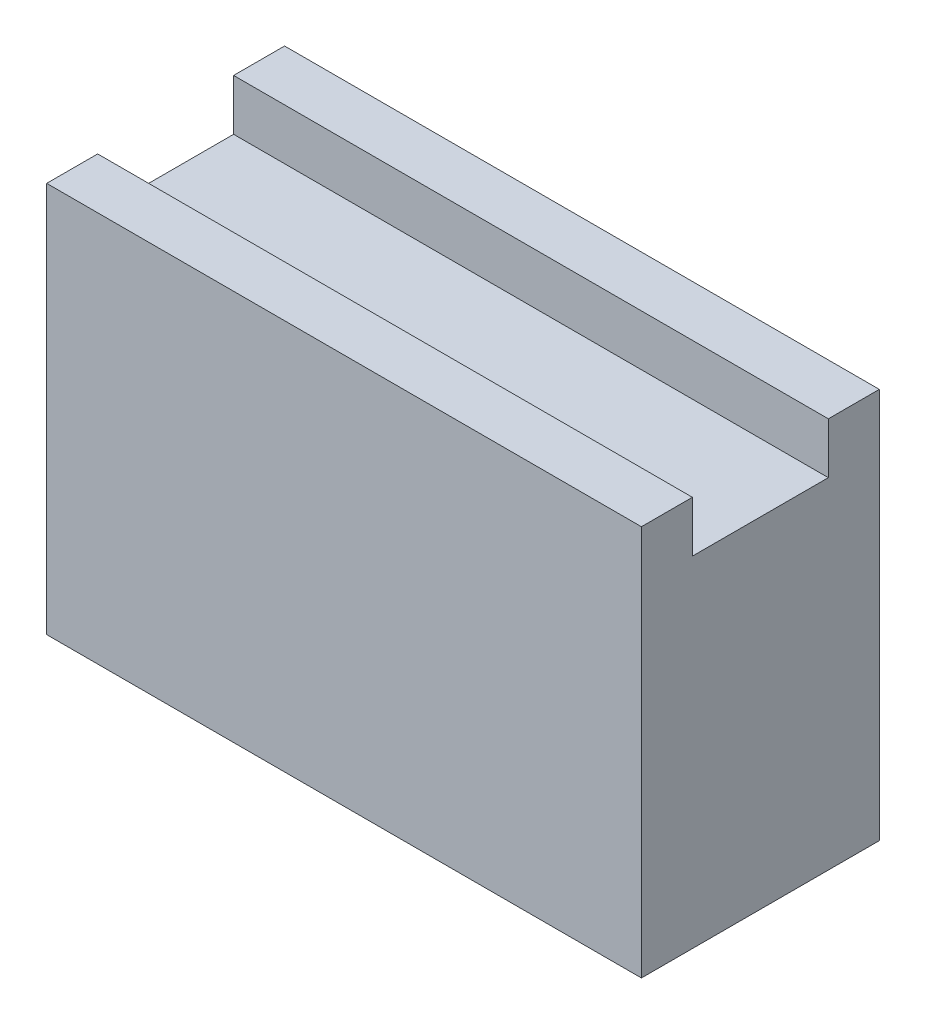
ISO-10303-21;
HEADER;
FILE_DESCRIPTION(('STEP AP214'),'2;1');
FILE_NAME('part.step','',(''),(''),'','','');
FILE_SCHEMA(('AUTOMOTIVE_DESIGN { 1 0 10303 214 1 1 1 1 }'));
ENDSEC;
DATA;
#1=APPLICATION_CONTEXT('core data for automotive mechanical design processes');
#2=APPLICATION_PROTOCOL_DEFINITION('international standard','automotive_design',2000,#1);
#3=PRODUCT_CONTEXT('',#1,'mechanical');
#4=PRODUCT('Part','Part','',(#3));
#5=PRODUCT_RELATED_PRODUCT_CATEGORY('part','',(#4));
#6=PRODUCT_DEFINITION_FORMATION('','',#4);
#7=PRODUCT_DEFINITION_CONTEXT('part definition',#1,'design');
#8=PRODUCT_DEFINITION('design','',#6,#7);
#9=PRODUCT_DEFINITION_SHAPE('','',#8);
#10=(LENGTH_UNIT() NAMED_UNIT(*) SI_UNIT(.MILLI.,.METRE.));
#11=(NAMED_UNIT(*) PLANE_ANGLE_UNIT() SI_UNIT($,.RADIAN.));
#12=(NAMED_UNIT(*) SI_UNIT($,.STERADIAN.) SOLID_ANGLE_UNIT());
#13=UNCERTAINTY_MEASURE_WITH_UNIT(LENGTH_MEASURE(1.E-05),#10,'distance_accuracy_value','');
#14=(GEOMETRIC_REPRESENTATION_CONTEXT(3) GLOBAL_UNCERTAINTY_ASSIGNED_CONTEXT((#13)) GLOBAL_UNIT_ASSIGNED_CONTEXT((#10,
#11,#12)) REPRESENTATION_CONTEXT('',''));
#15=CARTESIAN_POINT('',(0.,0.,0.));
#16=DIRECTION('',(0.,0.,1.));
#17=DIRECTION('',(1.,0.,0.));
#18=AXIS2_PLACEMENT_3D('',#15,#16,#17);
#19=CARTESIAN_POINT('',(-35.,-10.,-7.));
#20=DIRECTION('',(0.,0.,-1.));
#21=DIRECTION('',(-1.,0.,0.));
#22=AXIS2_PLACEMENT_3D('',#19,#20,#21);
#23=PLANE('',#22);
#24=DIRECTION('',(0.,1.,0.));
#25=VECTOR('',#24,1.);
#26=CARTESIAN_POINT('',(0.,-10.,-7.));
#27=LINE('',#26,#25);
#28=CARTESIAN_POINT('',(0.,-10.,-7.));
#29=VERTEX_POINT('',#28);
#30=CARTESIAN_POINT('',(0.,13.,-7.));
#31=VERTEX_POINT('',#30);
#32=EDGE_CURVE('E155',#29,#31,#27,.T.);
#33=ORIENTED_EDGE('',*,*,#32,.F.);
#34=DIRECTION('',(1.,0.,0.));
#35=VECTOR('',#34,1.);
#36=CARTESIAN_POINT('',(-35.,-10.,-7.));
#37=LINE('',#36,#35);
#38=CARTESIAN_POINT('',(-35.,-10.,-7.));
#39=VERTEX_POINT('',#38);
#40=EDGE_CURVE('E11',#39,#29,#37,.T.);
#41=ORIENTED_EDGE('',*,*,#40,.F.);
#42=DIRECTION('',(0.,1.,0.));
#43=VECTOR('',#42,1.);
#44=CARTESIAN_POINT('',(-35.,9.99999999999999,-7.));
#45=LINE('',#44,#43);
#46=CARTESIAN_POINT('',(-35.,13.,-7.));
#47=VERTEX_POINT('',#46);
#48=EDGE_CURVE('E58',#39,#47,#45,.T.);
#49=ORIENTED_EDGE('',*,*,#48,.T.);
#50=DIRECTION('',(1.,0.,0.));
#51=VECTOR('',#50,1.);
#52=CARTESIAN_POINT('',(-35.,13.,-7.));
#53=LINE('',#52,#51);
#54=EDGE_CURVE('E43',#47,#31,#53,.T.);
#55=ORIENTED_EDGE('',*,*,#54,.T.);
#56=EDGE_LOOP('',(#33,#41,#49,#55));
#57=FACE_BOUND('',#56,.T.);
#58=ADVANCED_FACE('F39',(#57),#23,.T.);
#59=CARTESIAN_POINT('',(-35.,-10.,7.));
#60=DIRECTION('',(0.,-1.,0.));
#61=DIRECTION('',(0.,0.,-1.));
#62=AXIS2_PLACEMENT_3D('',#59,#60,#61);
#63=PLANE('',#62);
#64=DIRECTION('',(0.,0.,-1.));
#65=VECTOR('',#64,1.);
#66=CARTESIAN_POINT('',(0.,-10.,7.));
#67=LINE('',#66,#65);
#68=CARTESIAN_POINT('',(0.,-10.,7.));
#69=VERTEX_POINT('',#68);
#70=EDGE_CURVE('E153',#69,#29,#67,.T.);
#71=ORIENTED_EDGE('',*,*,#70,.F.);
#72=DIRECTION('',(1.,0.,0.));
#73=VECTOR('',#72,1.);
#74=CARTESIAN_POINT('',(-35.,-10.,7.));
#75=LINE('',#74,#73);
#76=CARTESIAN_POINT('',(-35.,-10.,7.));
#77=VERTEX_POINT('',#76);
#78=EDGE_CURVE('E49',#77,#69,#75,.T.);
#79=ORIENTED_EDGE('',*,*,#78,.F.);
#80=DIRECTION('',(0.,0.,-1.));
#81=VECTOR('',#80,1.);
#82=CARTESIAN_POINT('',(-35.,-10.,7.));
#83=LINE('',#82,#81);
#84=EDGE_CURVE('E128',#77,#39,#83,.T.);
#85=ORIENTED_EDGE('',*,*,#84,.T.);
#86=ORIENTED_EDGE('',*,*,#40,.T.);
#87=EDGE_LOOP('',(#71,#79,#85,#86));
#88=FACE_BOUND('',#87,.T.);
#89=ADVANCED_FACE('F168',(#88),#63,.T.);
#90=CARTESIAN_POINT('',(-35.,-10.,7.));
#91=DIRECTION('',(0.,0.,1.));
#92=DIRECTION('',(1.,0.,0.));
#93=AXIS2_PLACEMENT_3D('',#90,#91,#92);
#94=PLANE('',#93);
#95=DIRECTION('',(0.,-1.,0.));
#96=VECTOR('',#95,1.);
#97=CARTESIAN_POINT('',(0.,-10.,7.));
#98=LINE('',#97,#96);
#99=CARTESIAN_POINT('',(0.,13.,7.));
#100=VERTEX_POINT('',#99);
#101=EDGE_CURVE('E116',#100,#69,#98,.T.);
#102=ORIENTED_EDGE('',*,*,#101,.F.);
#103=DIRECTION('',(1.,0.,0.));
#104=VECTOR('',#103,1.);
#105=CARTESIAN_POINT('',(-35.,13.,7.));
#106=LINE('',#105,#104);
#107=CARTESIAN_POINT('',(-35.,13.,7.));
#108=VERTEX_POINT('',#107);
#109=EDGE_CURVE('E111',#108,#100,#106,.T.);
#110=ORIENTED_EDGE('',*,*,#109,.F.);
#111=DIRECTION('',(0.,-1.,0.));
#112=VECTOR('',#111,1.);
#113=CARTESIAN_POINT('',(-35.,9.99999999999999,7.));
#114=LINE('',#113,#112);
#115=EDGE_CURVE('E114',#108,#77,#114,.T.);
#116=ORIENTED_EDGE('',*,*,#115,.T.);
#117=ORIENTED_EDGE('',*,*,#78,.T.);
#118=EDGE_LOOP('',(#102,#110,#116,#117));
#119=FACE_BOUND('',#118,.T.);
#120=ADVANCED_FACE('F113',(#119),#94,.T.);
#121=CARTESIAN_POINT('',(-35.,13.,7.));
#122=DIRECTION('',(0.,1.,0.));
#123=DIRECTION('',(0.,0.,1.));
#124=AXIS2_PLACEMENT_3D('',#121,#122,#123);
#125=PLANE('',#124);
#126=DIRECTION('',(0.,0.,1.));
#127=VECTOR('',#126,1.);
#128=CARTESIAN_POINT('',(0.,13.,7.));
#129=LINE('',#128,#127);
#130=CARTESIAN_POINT('',(0.,13.,4.));
#131=VERTEX_POINT('',#130);
#132=EDGE_CURVE('E150',#131,#100,#129,.T.);
#133=ORIENTED_EDGE('',*,*,#132,.F.);
#134=DIRECTION('',(1.,0.,0.));
#135=VECTOR('',#134,1.);
#136=CARTESIAN_POINT('',(-35.,13.,4.));
#137=LINE('',#136,#135);
#138=CARTESIAN_POINT('',(-35.,13.,4.));
#139=VERTEX_POINT('',#138);
#140=EDGE_CURVE('E121',#139,#131,#137,.T.);
#141=ORIENTED_EDGE('',*,*,#140,.F.);
#142=DIRECTION('',(0.,0.,1.));
#143=VECTOR('',#142,1.);
#144=CARTESIAN_POINT('',(-35.,13.,7.));
#145=LINE('',#144,#143);
#146=EDGE_CURVE('E126',#139,#108,#145,.T.);
#147=ORIENTED_EDGE('',*,*,#146,.T.);
#148=ORIENTED_EDGE('',*,*,#109,.T.);
#149=EDGE_LOOP('',(#133,#141,#147,#148));
#150=FACE_BOUND('',#149,.T.);
#151=ADVANCED_FACE('F130',(#150),#125,.T.);
#152=CARTESIAN_POINT('',(-35.,13.,4.));
#153=DIRECTION('',(0.,0.,-1.));
#154=DIRECTION('',(0.,1.,0.));
#155=AXIS2_PLACEMENT_3D('',#152,#153,#154);
#156=PLANE('',#155);
#157=DIRECTION('',(0.,1.,0.));
#158=VECTOR('',#157,1.);
#159=CARTESIAN_POINT('',(0.,13.,4.));
#160=LINE('',#159,#158);
#161=CARTESIAN_POINT('',(0.,9.99999999999999,4.));
#162=VERTEX_POINT('',#161);
#163=EDGE_CURVE('E147',#162,#131,#160,.T.);
#164=ORIENTED_EDGE('',*,*,#163,.F.);
#165=DIRECTION('',(1.,0.,0.));
#166=VECTOR('',#165,1.);
#167=CARTESIAN_POINT('',(-35.,9.99999999999999,4.));
#168=LINE('',#167,#166);
#169=CARTESIAN_POINT('',(-35.,9.99999999999999,4.));
#170=VERTEX_POINT('',#169);
#171=EDGE_CURVE('E159',#170,#162,#168,.T.);
#172=ORIENTED_EDGE('',*,*,#171,.F.);
#173=DIRECTION('',(0.,1.,0.));
#174=VECTOR('',#173,1.);
#175=CARTESIAN_POINT('',(-35.,13.,4.));
#176=LINE('',#175,#174);
#177=EDGE_CURVE('E131',#170,#139,#176,.T.);
#178=ORIENTED_EDGE('',*,*,#177,.T.);
#179=ORIENTED_EDGE('',*,*,#140,.T.);
#180=EDGE_LOOP('',(#164,#172,#178,#179));
#181=FACE_BOUND('',#180,.T.);
#182=ADVANCED_FACE('F181',(#181),#156,.T.);
#183=CARTESIAN_POINT('',(-35.,9.99999999999999,4.));
#184=DIRECTION('',(0.,1.,0.));
#185=DIRECTION('',(0.,0.,1.));
#186=AXIS2_PLACEMENT_3D('',#183,#184,#185);
#187=PLANE('',#186);
#188=DIRECTION('',(0.,0.,1.));
#189=VECTOR('',#188,1.);
#190=CARTESIAN_POINT('',(0.,9.99999999999999,4.));
#191=LINE('',#190,#189);
#192=CARTESIAN_POINT('',(0.,9.99999999999999,-4.));
#193=VERTEX_POINT('',#192);
#194=EDGE_CURVE('E144',#193,#162,#191,.T.);
#195=ORIENTED_EDGE('',*,*,#194,.F.);
#196=DIRECTION('',(1.,0.,0.));
#197=VECTOR('',#196,1.);
#198=CARTESIAN_POINT('',(-35.,9.99999999999999,-4.));
#199=LINE('',#198,#197);
#200=CARTESIAN_POINT('',(-35.,9.99999999999999,-4.));
#201=VERTEX_POINT('',#200);
#202=EDGE_CURVE('E161',#201,#193,#199,.T.);
#203=ORIENTED_EDGE('',*,*,#202,.F.);
#204=DIRECTION('',(0.,0.,1.));
#205=VECTOR('',#204,1.);
#206=CARTESIAN_POINT('',(-35.,9.99999999999999,4.));
#207=LINE('',#206,#205);
#208=EDGE_CURVE('E133',#201,#170,#207,.T.);
#209=ORIENTED_EDGE('',*,*,#208,.T.);
#210=ORIENTED_EDGE('',*,*,#171,.T.);
#211=EDGE_LOOP('',(#195,#203,#209,#210));
#212=FACE_BOUND('',#211,.T.);
#213=ADVANCED_FACE('F184',(#212),#187,.T.);
#214=CARTESIAN_POINT('',(-35.,13.,-4.));
#215=DIRECTION('',(0.,0.,1.));
#216=DIRECTION('',(0.,-1.,0.));
#217=AXIS2_PLACEMENT_3D('',#214,#215,#216);
#218=PLANE('',#217);
#219=DIRECTION('',(0.,-1.,0.));
#220=VECTOR('',#219,1.);
#221=CARTESIAN_POINT('',(0.,13.,-4.));
#222=LINE('',#221,#220);
#223=CARTESIAN_POINT('',(0.,13.,-4.));
#224=VERTEX_POINT('',#223);
#225=EDGE_CURVE('E141',#224,#193,#222,.T.);
#226=ORIENTED_EDGE('',*,*,#225,.F.);
#227=DIRECTION('',(1.,0.,0.));
#228=VECTOR('',#227,1.);
#229=CARTESIAN_POINT('',(-35.,13.,-4.));
#230=LINE('',#229,#228);
#231=CARTESIAN_POINT('',(-35.,13.,-4.));
#232=VERTEX_POINT('',#231);
#233=EDGE_CURVE('E162',#232,#224,#230,.T.);
#234=ORIENTED_EDGE('',*,*,#233,.F.);
#235=DIRECTION('',(0.,-1.,0.));
#236=VECTOR('',#235,1.);
#237=CARTESIAN_POINT('',(-35.,13.,-4.));
#238=LINE('',#237,#236);
#239=EDGE_CURVE('E197',#232,#201,#238,.T.);
#240=ORIENTED_EDGE('',*,*,#239,.T.);
#241=ORIENTED_EDGE('',*,*,#202,.T.);
#242=EDGE_LOOP('',(#226,#234,#240,#241));
#243=FACE_BOUND('',#242,.T.);
#244=ADVANCED_FACE('F187',(#243),#218,.T.);
#245=CARTESIAN_POINT('',(-35.,13.,-7.));
#246=DIRECTION('',(0.,1.,0.));
#247=DIRECTION('',(0.,0.,1.));
#248=AXIS2_PLACEMENT_3D('',#245,#246,#247);
#249=PLANE('',#248);
#250=DIRECTION('',(0.,0.,1.));
#251=VECTOR('',#250,1.);
#252=CARTESIAN_POINT('',(0.,13.,-7.));
#253=LINE('',#252,#251);
#254=EDGE_CURVE('E138',#31,#224,#253,.T.);
#255=ORIENTED_EDGE('',*,*,#254,.F.);
#256=ORIENTED_EDGE('',*,*,#54,.F.);
#257=DIRECTION('',(0.,0.,1.));
#258=VECTOR('',#257,1.);
#259=CARTESIAN_POINT('',(-35.,13.,-7.));
#260=LINE('',#259,#258);
#261=EDGE_CURVE('E201',#47,#232,#260,.T.);
#262=ORIENTED_EDGE('',*,*,#261,.T.);
#263=ORIENTED_EDGE('',*,*,#233,.T.);
#264=EDGE_LOOP('',(#255,#256,#262,#263));
#265=FACE_BOUND('',#264,.T.);
#266=ADVANCED_FACE('F41',(#265),#249,.T.);
#267=CARTESIAN_POINT('',(-35.,0.,0.));
#268=DIRECTION('',(1.,0.,0.));
#269=DIRECTION('',(0.,0.,-1.));
#270=AXIS2_PLACEMENT_3D('',#267,#268,#269);
#271=PLANE('',#270);
#272=ORIENTED_EDGE('',*,*,#48,.F.);
#273=ORIENTED_EDGE('',*,*,#84,.F.);
#274=ORIENTED_EDGE('',*,*,#115,.F.);
#275=ORIENTED_EDGE('',*,*,#146,.F.);
#276=ORIENTED_EDGE('',*,*,#177,.F.);
#277=ORIENTED_EDGE('',*,*,#208,.F.);
#278=ORIENTED_EDGE('',*,*,#239,.F.);
#279=ORIENTED_EDGE('',*,*,#261,.F.);
#280=EDGE_LOOP('',(#272,#273,#274,#275,#276,#277,#278,#279));
#281=FACE_BOUND('',#280,.T.);
#282=ADVANCED_FACE('F124',(#281),#271,.F.);
#283=CARTESIAN_POINT('',(0.,0.,0.));
#284=DIRECTION('',(1.,0.,0.));
#285=DIRECTION('',(0.,0.,-1.));
#286=AXIS2_PLACEMENT_3D('',#283,#284,#285);
#287=PLANE('',#286);
#288=ORIENTED_EDGE('',*,*,#32,.T.);
#289=ORIENTED_EDGE('',*,*,#254,.T.);
#290=ORIENTED_EDGE('',*,*,#225,.T.);
#291=ORIENTED_EDGE('',*,*,#194,.T.);
#292=ORIENTED_EDGE('',*,*,#163,.T.);
#293=ORIENTED_EDGE('',*,*,#132,.T.);
#294=ORIENTED_EDGE('',*,*,#101,.T.);
#295=ORIENTED_EDGE('',*,*,#70,.T.);
#296=EDGE_LOOP('',(#288,#289,#290,#291,#292,#293,#294,#295));
#297=FACE_BOUND('',#296,.T.);
#298=ADVANCED_FACE('F167',(#297),#287,.T.);
#299=CLOSED_SHELL('',(#58,#89,#120,#151,#182,#213,#244,#266,#282,#298));
#300=MANIFOLD_SOLID_BREP('B2',#299);
#301=ADVANCED_BREP_SHAPE_REPRESENTATION('',(#18,#300),#14);
#302=SHAPE_DEFINITION_REPRESENTATION(#9,#301);
ENDSEC;
END-ISO-10303-21;
